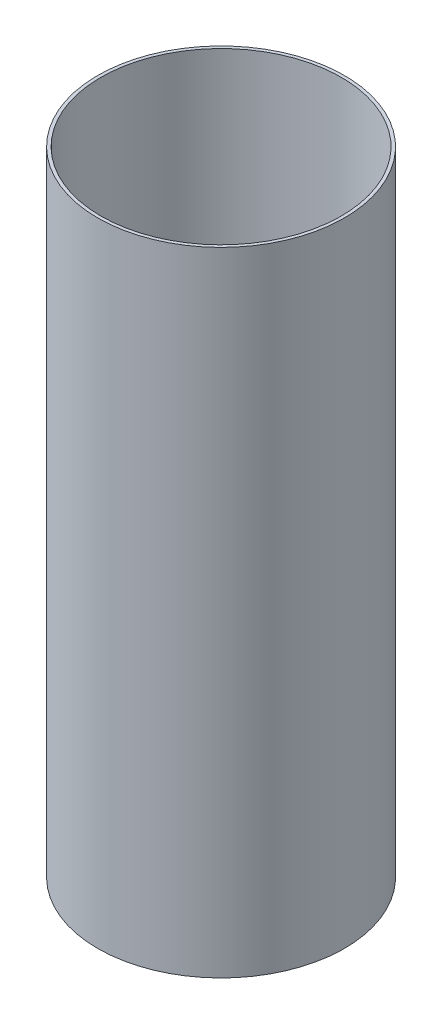
ISO-10303-21;
HEADER;
FILE_DESCRIPTION(('STEP AP214'),'2;1');
FILE_NAME('part.step','',(''),(''),'','','');
FILE_SCHEMA(('AUTOMOTIVE_DESIGN { 1 0 10303 214 1 1 1 1 }'));
ENDSEC;
DATA;
#1=APPLICATION_CONTEXT('core data for automotive mechanical design processes');
#2=APPLICATION_PROTOCOL_DEFINITION('international standard','automotive_design',2000,#1);
#3=PRODUCT_CONTEXT('',#1,'mechanical');
#4=PRODUCT('Part','Part','',(#3));
#5=PRODUCT_RELATED_PRODUCT_CATEGORY('part','',(#4));
#6=PRODUCT_DEFINITION_FORMATION('','',#4);
#7=PRODUCT_DEFINITION_CONTEXT('part definition',#1,'design');
#8=PRODUCT_DEFINITION('design','',#6,#7);
#9=PRODUCT_DEFINITION_SHAPE('','',#8);
#10=(LENGTH_UNIT() NAMED_UNIT(*) SI_UNIT(.MILLI.,.METRE.));
#11=(NAMED_UNIT(*) PLANE_ANGLE_UNIT() SI_UNIT($,.RADIAN.));
#12=(NAMED_UNIT(*) SI_UNIT($,.STERADIAN.) SOLID_ANGLE_UNIT());
#13=UNCERTAINTY_MEASURE_WITH_UNIT(LENGTH_MEASURE(1.E-05),#10,'distance_accuracy_value','');
#14=(GEOMETRIC_REPRESENTATION_CONTEXT(3) GLOBAL_UNCERTAINTY_ASSIGNED_CONTEXT((#13)) GLOBAL_UNIT_ASSIGNED_CONTEXT((#10,
#11,#12)) REPRESENTATION_CONTEXT('',''));
#15=CARTESIAN_POINT('',(0.,0.,0.));
#16=DIRECTION('',(0.,0.,1.));
#17=DIRECTION('',(1.,0.,0.));
#18=AXIS2_PLACEMENT_3D('',#15,#16,#17);
#19=CARTESIAN_POINT('',(0.,400.,0.));
#20=DIRECTION('',(0.,-1.,0.));
#21=DIRECTION('',(0.,0.,-1.));
#22=AXIS2_PLACEMENT_3D('',#19,#20,#21);
#23=CYLINDRICAL_SURFACE('',#22,76.);
#24=CARTESIAN_POINT('',(0.,400.,0.));
#25=DIRECTION('',(0.,1.,0.));
#26=DIRECTION('',(0.,0.,1.));
#27=AXIS2_PLACEMENT_3D('',#24,#25,#26);
#28=CIRCLE('',#27,76.);
#29=CARTESIAN_POINT('',(0.,400.,76.));
#30=VERTEX_POINT('',#29);
#31=EDGE_CURVE('E40',#30,#30,#28,.T.);
#32=ORIENTED_EDGE('',*,*,#31,.T.);
#33=EDGE_LOOP('',(#32));
#34=FACE_BOUND('',#33,.T.);
#35=CARTESIAN_POINT('',(0.,0.,0.));
#36=DIRECTION('',(0.,1.,0.));
#37=DIRECTION('',(0.,0.,1.));
#38=AXIS2_PLACEMENT_3D('',#35,#36,#37);
#39=CIRCLE('',#38,76.);
#40=CARTESIAN_POINT('',(0.,0.,76.));
#41=VERTEX_POINT('',#40);
#42=EDGE_CURVE('E46',#41,#41,#39,.T.);
#43=ORIENTED_EDGE('',*,*,#42,.F.);
#44=EDGE_LOOP('',(#43));
#45=FACE_BOUND('',#44,.T.);
#46=ADVANCED_FACE('F33',(#34,#45),#23,.F.);
#47=CARTESIAN_POINT('',(0.,400.,0.));
#48=DIRECTION('',(0.,-1.,0.));
#49=DIRECTION('',(0.,0.,-1.));
#50=AXIS2_PLACEMENT_3D('',#47,#48,#49);
#51=CYLINDRICAL_SURFACE('',#50,78.);
#52=CARTESIAN_POINT('',(0.,400.,0.));
#53=DIRECTION('',(0.,1.,0.));
#54=DIRECTION('',(0.,0.,1.));
#55=AXIS2_PLACEMENT_3D('',#52,#53,#54);
#56=CIRCLE('',#55,78.);
#57=CARTESIAN_POINT('',(0.,400.,78.));
#58=VERTEX_POINT('',#57);
#59=EDGE_CURVE('E10',#58,#58,#56,.T.);
#60=ORIENTED_EDGE('',*,*,#59,.F.);
#61=EDGE_LOOP('',(#60));
#62=FACE_BOUND('',#61,.T.);
#63=CARTESIAN_POINT('',(0.,0.,0.));
#64=DIRECTION('',(0.,1.,0.));
#65=DIRECTION('',(0.,0.,1.));
#66=AXIS2_PLACEMENT_3D('',#63,#64,#65);
#67=CIRCLE('',#66,78.);
#68=CARTESIAN_POINT('',(0.,0.,78.));
#69=VERTEX_POINT('',#68);
#70=EDGE_CURVE('E36',#69,#69,#67,.T.);
#71=ORIENTED_EDGE('',*,*,#70,.T.);
#72=EDGE_LOOP('',(#71));
#73=FACE_BOUND('',#72,.T.);
#74=ADVANCED_FACE('F53',(#62,#73),#51,.T.);
#75=CARTESIAN_POINT('',(0.,400.,0.));
#76=DIRECTION('',(0.,1.,0.));
#77=DIRECTION('',(0.,0.,1.));
#78=AXIS2_PLACEMENT_3D('',#75,#76,#77);
#79=PLANE('',#78);
#80=ORIENTED_EDGE('',*,*,#31,.F.);
#81=EDGE_LOOP('',(#80));
#82=FACE_BOUND('',#81,.T.);
#83=ORIENTED_EDGE('',*,*,#59,.T.);
#84=EDGE_LOOP('',(#83));
#85=FACE_BOUND('',#84,.T.);
#86=ADVANCED_FACE('F57',(#82,#85),#79,.T.);
#87=CARTESIAN_POINT('',(0.,0.,0.));
#88=DIRECTION('',(0.,1.,0.));
#89=DIRECTION('',(0.,0.,1.));
#90=AXIS2_PLACEMENT_3D('',#87,#88,#89);
#91=PLANE('',#90);
#92=ORIENTED_EDGE('',*,*,#42,.T.);
#93=EDGE_LOOP('',(#92));
#94=FACE_BOUND('',#93,.T.);
#95=ORIENTED_EDGE('',*,*,#70,.F.);
#96=EDGE_LOOP('',(#95));
#97=FACE_BOUND('',#96,.T.);
#98=ADVANCED_FACE('F55',(#94,#97),#91,.F.);
#99=CLOSED_SHELL('',(#46,#74,#86,#98));
#100=MANIFOLD_SOLID_BREP('B2',#99);
#101=ADVANCED_BREP_SHAPE_REPRESENTATION('',(#18,#100),#14);
#102=SHAPE_DEFINITION_REPRESENTATION(#9,#101);
ENDSEC;
END-ISO-10303-21;
